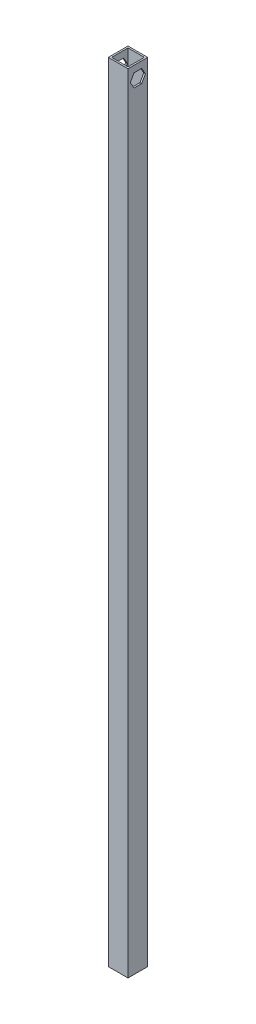
ISO-10303-21;
HEADER;
FILE_DESCRIPTION(('STEP AP214'),'2;1');
FILE_NAME('part.step','',(''),(''),'','','');
FILE_SCHEMA(('AUTOMOTIVE_DESIGN { 1 0 10303 214 1 1 1 1 }'));
ENDSEC;
DATA;
#1=APPLICATION_CONTEXT('core data for automotive mechanical design processes');
#2=APPLICATION_PROTOCOL_DEFINITION('international standard','automotive_design',2000,#1);
#3=PRODUCT_CONTEXT('',#1,'mechanical');
#4=PRODUCT('Part','Part','',(#3));
#5=PRODUCT_RELATED_PRODUCT_CATEGORY('part','',(#4));
#6=PRODUCT_DEFINITION_FORMATION('','',#4);
#7=PRODUCT_DEFINITION_CONTEXT('part definition',#1,'design');
#8=PRODUCT_DEFINITION('design','',#6,#7);
#9=PRODUCT_DEFINITION_SHAPE('','',#8);
#10=(LENGTH_UNIT() NAMED_UNIT(*) SI_UNIT(.MILLI.,.METRE.));
#11=(NAMED_UNIT(*) PLANE_ANGLE_UNIT() SI_UNIT($,.RADIAN.));
#12=(NAMED_UNIT(*) SI_UNIT($,.STERADIAN.) SOLID_ANGLE_UNIT());
#13=UNCERTAINTY_MEASURE_WITH_UNIT(LENGTH_MEASURE(1.E-05),#10,'distance_accuracy_value','');
#14=(GEOMETRIC_REPRESENTATION_CONTEXT(3) GLOBAL_UNCERTAINTY_ASSIGNED_CONTEXT((#13)) GLOBAL_UNIT_ASSIGNED_CONTEXT((#10,
#11,#12)) REPRESENTATION_CONTEXT('',''));
#15=CARTESIAN_POINT('',(0.,0.,0.));
#16=DIRECTION('',(0.,0.,1.));
#17=DIRECTION('',(1.,0.,0.));
#18=AXIS2_PLACEMENT_3D('',#15,#16,#17);
#19=CARTESIAN_POINT('',(0.,1524.,0.));
#20=DIRECTION('',(0.,-1.,0.));
#21=DIRECTION('',(0.,0.,-1.));
#22=AXIS2_PLACEMENT_3D('',#19,#20,#21);
#23=PLANE('',#22);
#24=DIRECTION('',(0.,0.,1.));
#25=VECTOR('',#24,1.);
#26=CARTESIAN_POINT('',(0.,1524.,0.));
#27=LINE('',#26,#25);
#28=CARTESIAN_POINT('',(0.,1524.,-38.1));
#29=VERTEX_POINT('',#28);
#30=CARTESIAN_POINT('',(0.,1524.,0.));
#31=VERTEX_POINT('',#30);
#32=EDGE_CURVE('E279',#29,#31,#27,.T.);
#33=ORIENTED_EDGE('',*,*,#32,.T.);
#34=DIRECTION('',(1.,0.,0.));
#35=VECTOR('',#34,1.);
#36=CARTESIAN_POINT('',(0.,1524.,0.));
#37=LINE('',#36,#35);
#38=CARTESIAN_POINT('',(38.1,1524.,0.));
#39=VERTEX_POINT('',#38);
#40=EDGE_CURVE('E282',#31,#39,#37,.T.);
#41=ORIENTED_EDGE('',*,*,#40,.T.);
#42=DIRECTION('',(0.,0.,-1.));
#43=VECTOR('',#42,1.);
#44=CARTESIAN_POINT('',(38.1,1524.,0.));
#45=LINE('',#44,#43);
#46=CARTESIAN_POINT('',(38.1,1524.,-38.1));
#47=VERTEX_POINT('',#46);
#48=EDGE_CURVE('E285',#39,#47,#45,.T.);
#49=ORIENTED_EDGE('',*,*,#48,.T.);
#50=DIRECTION('',(-1.,0.,0.));
#51=VECTOR('',#50,1.);
#52=CARTESIAN_POINT('',(0.,1524.,-38.1));
#53=LINE('',#52,#51);
#54=EDGE_CURVE('E287',#47,#29,#53,.T.);
#55=ORIENTED_EDGE('',*,*,#54,.T.);
#56=EDGE_LOOP('',(#33,#41,#49,#55));
#57=FACE_BOUND('',#56,.T.);
#58=DIRECTION('',(0.,0.,1.));
#59=VECTOR('',#58,1.);
#60=CARTESIAN_POINT('',(3.175,1524.,-3.175));
#61=LINE('',#60,#59);
#62=CARTESIAN_POINT('',(3.175,1524.,-34.925));
#63=VERTEX_POINT('',#62);
#64=CARTESIAN_POINT('',(3.175,1524.,-3.175));
#65=VERTEX_POINT('',#64);
#66=EDGE_CURVE('E248',#63,#65,#61,.T.);
#67=ORIENTED_EDGE('',*,*,#66,.F.);
#68=DIRECTION('',(-1.,0.,0.));
#69=VECTOR('',#68,1.);
#70=CARTESIAN_POINT('',(3.175,1524.,-34.925));
#71=LINE('',#70,#69);
#72=CARTESIAN_POINT('',(34.925,1524.,-34.925));
#73=VERTEX_POINT('',#72);
#74=EDGE_CURVE('E256',#73,#63,#71,.T.);
#75=ORIENTED_EDGE('',*,*,#74,.F.);
#76=DIRECTION('',(0.,0.,-1.));
#77=VECTOR('',#76,1.);
#78=CARTESIAN_POINT('',(34.925,1524.,-3.175));
#79=LINE('',#78,#77);
#80=CARTESIAN_POINT('',(34.925,1524.,-3.175));
#81=VERTEX_POINT('',#80);
#82=EDGE_CURVE('E253',#81,#73,#79,.T.);
#83=ORIENTED_EDGE('',*,*,#82,.F.);
#84=DIRECTION('',(1.,0.,0.));
#85=VECTOR('',#84,1.);
#86=CARTESIAN_POINT('',(3.175,1524.,-3.175));
#87=LINE('',#86,#85);
#88=EDGE_CURVE('E250',#65,#81,#87,.T.);
#89=ORIENTED_EDGE('',*,*,#88,.F.);
#90=EDGE_LOOP('',(#67,#75,#83,#89));
#91=FACE_BOUND('',#90,.T.);
#92=ADVANCED_FACE('F33',(#57,#91),#23,.F.);
#93=CARTESIAN_POINT('',(0.,0.,0.));
#94=DIRECTION('',(0.,-1.,0.));
#95=DIRECTION('',(0.,0.,-1.));
#96=AXIS2_PLACEMENT_3D('',#93,#94,#95);
#97=PLANE('',#96);
#98=DIRECTION('',(0.,0.,1.));
#99=VECTOR('',#98,1.);
#100=CARTESIAN_POINT('',(0.,0.,0.));
#101=LINE('',#100,#99);
#102=CARTESIAN_POINT('',(0.,0.,-38.1));
#103=VERTEX_POINT('',#102);
#104=CARTESIAN_POINT('',(0.,0.,0.));
#105=VERTEX_POINT('',#104);
#106=EDGE_CURVE('E278',#103,#105,#101,.T.);
#107=ORIENTED_EDGE('',*,*,#106,.F.);
#108=DIRECTION('',(-1.,0.,0.));
#109=VECTOR('',#108,1.);
#110=CARTESIAN_POINT('',(0.,0.,-38.1));
#111=LINE('',#110,#109);
#112=CARTESIAN_POINT('',(38.1,0.,-38.1));
#113=VERTEX_POINT('',#112);
#114=EDGE_CURVE('E283',#113,#103,#111,.T.);
#115=ORIENTED_EDGE('',*,*,#114,.F.);
#116=DIRECTION('',(0.,0.,-1.));
#117=VECTOR('',#116,1.);
#118=CARTESIAN_POINT('',(38.1,0.,0.));
#119=LINE('',#118,#117);
#120=CARTESIAN_POINT('',(38.1,0.,0.));
#121=VERTEX_POINT('',#120);
#122=EDGE_CURVE('E294',#121,#113,#119,.T.);
#123=ORIENTED_EDGE('',*,*,#122,.F.);
#124=DIRECTION('',(1.,0.,0.));
#125=VECTOR('',#124,1.);
#126=CARTESIAN_POINT('',(0.,0.,0.));
#127=LINE('',#126,#125);
#128=EDGE_CURVE('E292',#105,#121,#127,.T.);
#129=ORIENTED_EDGE('',*,*,#128,.F.);
#130=EDGE_LOOP('',(#107,#115,#123,#129));
#131=FACE_BOUND('',#130,.T.);
#132=DIRECTION('',(-1.,0.,0.));
#133=VECTOR('',#132,1.);
#134=CARTESIAN_POINT('',(3.175,0.,-34.925));
#135=LINE('',#134,#133);
#136=CARTESIAN_POINT('',(34.925,0.,-34.925));
#137=VERTEX_POINT('',#136);
#138=CARTESIAN_POINT('',(3.175,0.,-34.925));
#139=VERTEX_POINT('',#138);
#140=EDGE_CURVE('E251',#137,#139,#135,.T.);
#141=ORIENTED_EDGE('',*,*,#140,.T.);
#142=DIRECTION('',(0.,0.,1.));
#143=VECTOR('',#142,1.);
#144=CARTESIAN_POINT('',(3.175,0.,-3.175));
#145=LINE('',#144,#143);
#146=CARTESIAN_POINT('',(3.175,0.,-3.175));
#147=VERTEX_POINT('',#146);
#148=EDGE_CURVE('E247',#139,#147,#145,.T.);
#149=ORIENTED_EDGE('',*,*,#148,.T.);
#150=DIRECTION('',(1.,0.,0.));
#151=VECTOR('',#150,1.);
#152=CARTESIAN_POINT('',(3.175,0.,-3.175));
#153=LINE('',#152,#151);
#154=CARTESIAN_POINT('',(34.925,0.,-3.175));
#155=VERTEX_POINT('',#154);
#156=EDGE_CURVE('E261',#147,#155,#153,.T.);
#157=ORIENTED_EDGE('',*,*,#156,.T.);
#158=DIRECTION('',(0.,0.,-1.));
#159=VECTOR('',#158,1.);
#160=CARTESIAN_POINT('',(34.925,0.,-3.175));
#161=LINE('',#160,#159);
#162=EDGE_CURVE('E264',#155,#137,#161,.T.);
#163=ORIENTED_EDGE('',*,*,#162,.T.);
#164=EDGE_LOOP('',(#141,#149,#157,#163));
#165=FACE_BOUND('',#164,.T.);
#166=ADVANCED_FACE('F359',(#131,#165),#97,.T.);
#167=CARTESIAN_POINT('',(0.,1524.,0.));
#168=DIRECTION('',(1.,0.,0.));
#169=DIRECTION('',(0.,0.,-1.));
#170=AXIS2_PLACEMENT_3D('',#167,#168,#169);
#171=PLANE('',#170);
#172=DIRECTION('',(0.,0.,-1.));
#173=VECTOR('',#172,1.);
#174=CARTESIAN_POINT('',(0.,1485.9,-11.7176515812917));
#175=LINE('',#174,#173);
#176=CARTESIAN_POINT('',(0.,1485.9,-11.7176515812917));
#177=VERTEX_POINT('',#176);
#178=CARTESIAN_POINT('',(0.,1485.9,-26.3823484187083));
#179=VERTEX_POINT('',#178);
#180=EDGE_CURVE('E194',#177,#179,#175,.T.);
#181=ORIENTED_EDGE('',*,*,#180,.T.);
#182=DIRECTION('',(0.,0.866025403784437,-0.500000000000003));
#183=VECTOR('',#182,1.);
#184=CARTESIAN_POINT('',(0.,1485.9,-26.3823484187083));
#185=LINE('',#184,#183);
#186=CARTESIAN_POINT('',(0.,1498.6,-33.7146968374168));
#187=VERTEX_POINT('',#186);
#188=EDGE_CURVE('E176',#179,#187,#185,.T.);
#189=ORIENTED_EDGE('',*,*,#188,.T.);
#190=DIRECTION('',(0.,0.86602540378444,0.499999999999997));
#191=VECTOR('',#190,1.);
#192=CARTESIAN_POINT('',(0.,1498.6,-33.7146968374168));
#193=LINE('',#192,#191);
#194=CARTESIAN_POINT('',(0.,1511.3,-26.3823484187084));
#195=VERTEX_POINT('',#194);
#196=EDGE_CURVE('E186',#187,#195,#193,.T.);
#197=ORIENTED_EDGE('',*,*,#196,.T.);
#198=DIRECTION('',(0.,0.,1.));
#199=VECTOR('',#198,1.);
#200=CARTESIAN_POINT('',(0.,1511.3,-26.3823484187084));
#201=LINE('',#200,#199);
#202=CARTESIAN_POINT('',(0.,1511.3,-11.7176515812918));
#203=VERTEX_POINT('',#202);
#204=EDGE_CURVE('E48',#195,#203,#201,.T.);
#205=ORIENTED_EDGE('',*,*,#204,.T.);
#206=DIRECTION('',(0.,-0.86602540378444,0.499999999999997));
#207=VECTOR('',#206,1.);
#208=CARTESIAN_POINT('',(0.,1511.3,-11.7176515812918));
#209=LINE('',#208,#207);
#210=CARTESIAN_POINT('',(0.,1498.6,-4.38530316258331));
#211=VERTEX_POINT('',#210);
#212=EDGE_CURVE('E202',#203,#211,#209,.T.);
#213=ORIENTED_EDGE('',*,*,#212,.T.);
#214=DIRECTION('',(0.,-0.866025403784437,-0.500000000000003));
#215=VECTOR('',#214,1.);
#216=CARTESIAN_POINT('',(0.,1498.6,-4.38530316258331));
#217=LINE('',#216,#215);
#218=EDGE_CURVE('E205',#211,#177,#217,.T.);
#219=ORIENTED_EDGE('',*,*,#218,.T.);
#220=EDGE_LOOP('',(#181,#189,#197,#205,#213,#219));
#221=FACE_BOUND('',#220,.T.);
#222=ORIENTED_EDGE('',*,*,#106,.T.);
#223=DIRECTION('',(0.,-1.,0.));
#224=VECTOR('',#223,1.);
#225=CARTESIAN_POINT('',(0.,1524.,0.));
#226=LINE('',#225,#224);
#227=EDGE_CURVE('E305',#31,#105,#226,.T.);
#228=ORIENTED_EDGE('',*,*,#227,.F.);
#229=ORIENTED_EDGE('',*,*,#32,.F.);
#230=DIRECTION('',(0.,-1.,0.));
#231=VECTOR('',#230,1.);
#232=CARTESIAN_POINT('',(0.,1524.,-38.1));
#233=LINE('',#232,#231);
#234=EDGE_CURVE('E289',#29,#103,#233,.T.);
#235=ORIENTED_EDGE('',*,*,#234,.T.);
#236=EDGE_LOOP('',(#222,#228,#229,#235));
#237=FACE_BOUND('',#236,.T.);
#238=ADVANCED_FACE('F35',(#221,#237),#171,.F.);
#239=CARTESIAN_POINT('',(0.,1524.,0.));
#240=DIRECTION('',(0.,0.,-1.));
#241=DIRECTION('',(-1.,0.,0.));
#242=AXIS2_PLACEMENT_3D('',#239,#240,#241);
#243=PLANE('',#242);
#244=ORIENTED_EDGE('',*,*,#128,.T.);
#245=DIRECTION('',(0.,-1.,0.));
#246=VECTOR('',#245,1.);
#247=CARTESIAN_POINT('',(38.1,1524.,0.));
#248=LINE('',#247,#246);
#249=EDGE_CURVE('E302',#39,#121,#248,.T.);
#250=ORIENTED_EDGE('',*,*,#249,.F.);
#251=ORIENTED_EDGE('',*,*,#40,.F.);
#252=ORIENTED_EDGE('',*,*,#227,.T.);
#253=EDGE_LOOP('',(#244,#250,#251,#252));
#254=FACE_BOUND('',#253,.T.);
#255=ADVANCED_FACE('F377',(#254),#243,.F.);
#256=CARTESIAN_POINT('',(38.1,1524.,0.));
#257=DIRECTION('',(-1.,0.,0.));
#258=DIRECTION('',(0.,0.,1.));
#259=AXIS2_PLACEMENT_3D('',#256,#257,#258);
#260=PLANE('',#259);
#261=DIRECTION('',(0.,0.86602540378444,0.499999999999997));
#262=VECTOR('',#261,1.);
#263=CARTESIAN_POINT('',(38.1,1498.6,-33.7146968374168));
#264=LINE('',#263,#262);
#265=CARTESIAN_POINT('',(38.1,1498.6,-33.7146968374167));
#266=VERTEX_POINT('',#265);
#267=CARTESIAN_POINT('',(38.1,1511.3,-26.3823484187084));
#268=VERTEX_POINT('',#267);
#269=EDGE_CURVE('E209',#266,#268,#264,.T.);
#270=ORIENTED_EDGE('',*,*,#269,.F.);
#271=DIRECTION('',(0.,0.866025403784437,-0.500000000000003));
#272=VECTOR('',#271,1.);
#273=CARTESIAN_POINT('',(38.1,1485.9,-26.3823484187083));
#274=LINE('',#273,#272);
#275=CARTESIAN_POINT('',(38.1,1485.9,-26.3823484187083));
#276=VERTEX_POINT('',#275);
#277=EDGE_CURVE('E56',#276,#266,#274,.T.);
#278=ORIENTED_EDGE('',*,*,#277,.F.);
#279=DIRECTION('',(0.,0.,-1.));
#280=VECTOR('',#279,1.);
#281=CARTESIAN_POINT('',(38.1,1485.9,-11.7176515812917));
#282=LINE('',#281,#280);
#283=CARTESIAN_POINT('',(38.1,1485.9,-11.7176515812917));
#284=VERTEX_POINT('',#283);
#285=EDGE_CURVE('E195',#284,#276,#282,.T.);
#286=ORIENTED_EDGE('',*,*,#285,.F.);
#287=DIRECTION('',(0.,-0.866025403784437,-0.500000000000003));
#288=VECTOR('',#287,1.);
#289=CARTESIAN_POINT('',(38.1,1498.6,-4.38530316258332));
#290=LINE('',#289,#288);
#291=CARTESIAN_POINT('',(38.1,1498.6,-4.38530316258332));
#292=VERTEX_POINT('',#291);
#293=EDGE_CURVE('E198',#292,#284,#290,.T.);
#294=ORIENTED_EDGE('',*,*,#293,.F.);
#295=DIRECTION('',(0.,-0.86602540378444,0.499999999999997));
#296=VECTOR('',#295,1.);
#297=CARTESIAN_POINT('',(38.1,1511.3,-11.7176515812919));
#298=LINE('',#297,#296);
#299=CARTESIAN_POINT('',(38.1,1511.3,-11.7176515812919));
#300=VERTEX_POINT('',#299);
#301=EDGE_CURVE('E215',#300,#292,#298,.T.);
#302=ORIENTED_EDGE('',*,*,#301,.F.);
#303=DIRECTION('',(0.,0.,1.));
#304=VECTOR('',#303,1.);
#305=CARTESIAN_POINT('',(38.1,1511.3,-26.3823484187084));
#306=LINE('',#305,#304);
#307=EDGE_CURVE('E212',#268,#300,#306,.T.);
#308=ORIENTED_EDGE('',*,*,#307,.F.);
#309=EDGE_LOOP('',(#270,#278,#286,#294,#302,#308));
#310=FACE_BOUND('',#309,.T.);
#311=ORIENTED_EDGE('',*,*,#122,.T.);
#312=DIRECTION('',(0.,-1.,0.));
#313=VECTOR('',#312,1.);
#314=CARTESIAN_POINT('',(38.1,1524.,-38.1));
#315=LINE('',#314,#313);
#316=EDGE_CURVE('E299',#47,#113,#315,.T.);
#317=ORIENTED_EDGE('',*,*,#316,.F.);
#318=ORIENTED_EDGE('',*,*,#48,.F.);
#319=ORIENTED_EDGE('',*,*,#249,.T.);
#320=EDGE_LOOP('',(#311,#317,#318,#319));
#321=FACE_BOUND('',#320,.T.);
#322=ADVANCED_FACE('F343',(#310,#321),#260,.F.);
#323=CARTESIAN_POINT('',(0.,1524.,-38.1));
#324=DIRECTION('',(0.,0.,1.));
#325=DIRECTION('',(1.,0.,0.));
#326=AXIS2_PLACEMENT_3D('',#323,#324,#325);
#327=PLANE('',#326);
#328=ORIENTED_EDGE('',*,*,#114,.T.);
#329=ORIENTED_EDGE('',*,*,#234,.F.);
#330=ORIENTED_EDGE('',*,*,#54,.F.);
#331=ORIENTED_EDGE('',*,*,#316,.T.);
#332=EDGE_LOOP('',(#328,#329,#330,#331));
#333=FACE_BOUND('',#332,.T.);
#334=ADVANCED_FACE('F372',(#333),#327,.F.);
#335=CARTESIAN_POINT('',(3.175,1524.,-3.175));
#336=DIRECTION('',(1.,0.,0.));
#337=DIRECTION('',(0.,0.,-1.));
#338=AXIS2_PLACEMENT_3D('',#335,#336,#337);
#339=PLANE('',#338);
#340=DIRECTION('',(0.,0.866025403784437,-0.500000000000003));
#341=VECTOR('',#340,1.);
#342=CARTESIAN_POINT('',(3.175,1504.42592335746,-37.078295256125));
#343=LINE('',#342,#341);
#344=CARTESIAN_POINT('',(3.175,1485.9,-26.3823484187083));
#345=VERTEX_POINT('',#344);
#346=CARTESIAN_POINT('',(3.175,1498.6,-33.7146968374167));
#347=VERTEX_POINT('',#346);
#348=EDGE_CURVE('E179',#345,#347,#343,.T.);
#349=ORIENTED_EDGE('',*,*,#348,.F.);
#350=DIRECTION('',(0.,0.,-1.));
#351=VECTOR('',#350,1.);
#352=CARTESIAN_POINT('',(3.175,1485.9,-3.175));
#353=LINE('',#352,#351);
#354=CARTESIAN_POINT('',(3.175,1485.9,-11.7176515812917));
#355=VERTEX_POINT('',#354);
#356=EDGE_CURVE('E244',#355,#345,#353,.T.);
#357=ORIENTED_EDGE('',*,*,#356,.F.);
#358=DIRECTION('',(0.,-0.866025403784437,-0.500000000000003));
#359=VECTOR('',#358,1.);
#360=CARTESIAN_POINT('',(3.175,1518.17407664254,6.91579525612507));
#361=LINE('',#360,#359);
#362=CARTESIAN_POINT('',(3.175,1498.6,-4.38530316258331));
#363=VERTEX_POINT('',#362);
#364=EDGE_CURVE('E242',#363,#355,#361,.T.);
#365=ORIENTED_EDGE('',*,*,#364,.F.);
#366=DIRECTION('',(0.,-0.86602540378444,0.499999999999997));
#367=VECTOR('',#366,1.);
#368=CARTESIAN_POINT('',(3.175,1517.12592335746,-15.0812499999999));
#369=LINE('',#368,#367);
#370=CARTESIAN_POINT('',(3.175,1511.3,-11.7176515812918));
#371=VERTEX_POINT('',#370);
#372=EDGE_CURVE('E240',#371,#363,#369,.T.);
#373=ORIENTED_EDGE('',*,*,#372,.F.);
#374=DIRECTION('',(0.,0.,1.));
#375=VECTOR('',#374,1.);
#376=CARTESIAN_POINT('',(3.175,1511.3,-3.175));
#377=LINE('',#376,#375);
#378=CARTESIAN_POINT('',(3.175,1511.3,-26.3823484187084));
#379=VERTEX_POINT('',#378);
#380=EDGE_CURVE('E238',#379,#371,#377,.T.);
#381=ORIENTED_EDGE('',*,*,#380,.F.);
#382=DIRECTION('',(0.,0.86602540378444,0.499999999999997));
#383=VECTOR('',#382,1.);
#384=CARTESIAN_POINT('',(3.175,1530.87407664254,-15.0812500000003));
#385=LINE('',#384,#383);
#386=EDGE_CURVE('E222',#347,#379,#385,.T.);
#387=ORIENTED_EDGE('',*,*,#386,.F.);
#388=EDGE_LOOP('',(#349,#357,#365,#373,#381,#387));
#389=FACE_BOUND('',#388,.T.);
#390=ORIENTED_EDGE('',*,*,#148,.F.);
#391=DIRECTION('',(0.,-1.,0.));
#392=VECTOR('',#391,1.);
#393=CARTESIAN_POINT('',(3.175,1524.,-34.925));
#394=LINE('',#393,#392);
#395=EDGE_CURVE('E258',#63,#139,#394,.T.);
#396=ORIENTED_EDGE('',*,*,#395,.F.);
#397=ORIENTED_EDGE('',*,*,#66,.T.);
#398=DIRECTION('',(0.,-1.,0.));
#399=VECTOR('',#398,1.);
#400=CARTESIAN_POINT('',(3.175,1524.,-3.175));
#401=LINE('',#400,#399);
#402=EDGE_CURVE('E275',#65,#147,#401,.T.);
#403=ORIENTED_EDGE('',*,*,#402,.T.);
#404=EDGE_LOOP('',(#390,#396,#397,#403));
#405=FACE_BOUND('',#404,.T.);
#406=ADVANCED_FACE('F369',(#389,#405),#339,.T.);
#407=CARTESIAN_POINT('',(3.175,1524.,-3.175));
#408=DIRECTION('',(0.,0.,-1.));
#409=DIRECTION('',(-1.,0.,0.));
#410=AXIS2_PLACEMENT_3D('',#407,#408,#409);
#411=PLANE('',#410);
#412=ORIENTED_EDGE('',*,*,#156,.F.);
#413=ORIENTED_EDGE('',*,*,#402,.F.);
#414=ORIENTED_EDGE('',*,*,#88,.T.);
#415=DIRECTION('',(0.,-1.,0.));
#416=VECTOR('',#415,1.);
#417=CARTESIAN_POINT('',(34.925,1524.,-3.175));
#418=LINE('',#417,#416);
#419=EDGE_CURVE('E273',#81,#155,#418,.T.);
#420=ORIENTED_EDGE('',*,*,#419,.T.);
#421=EDGE_LOOP('',(#412,#413,#414,#420));
#422=FACE_BOUND('',#421,.T.);
#423=ADVANCED_FACE('F409',(#422),#411,.T.);
#424=CARTESIAN_POINT('',(34.925,1524.,-3.175));
#425=DIRECTION('',(-1.,0.,0.));
#426=DIRECTION('',(0.,0.,1.));
#427=AXIS2_PLACEMENT_3D('',#424,#425,#426);
#428=PLANE('',#427);
#429=DIRECTION('',(0.,-0.866025403784437,0.500000000000003));
#430=VECTOR('',#429,1.);
#431=CARTESIAN_POINT('',(34.925,1504.42592335746,-37.078295256125));
#432=LINE('',#431,#430);
#433=CARTESIAN_POINT('',(34.925,1498.6,-33.7146968374168));
#434=VERTEX_POINT('',#433);
#435=CARTESIAN_POINT('',(34.925,1485.9,-26.3823484187083));
#436=VERTEX_POINT('',#435);
#437=EDGE_CURVE('E11',#434,#436,#432,.T.);
#438=ORIENTED_EDGE('',*,*,#437,.F.);
#439=DIRECTION('',(0.,-0.86602540378444,-0.499999999999997));
#440=VECTOR('',#439,1.);
#441=CARTESIAN_POINT('',(34.925,1530.87407664254,-15.0812500000003));
#442=LINE('',#441,#440);
#443=CARTESIAN_POINT('',(34.925,1511.3,-26.3823484187084));
#444=VERTEX_POINT('',#443);
#445=EDGE_CURVE('E308',#444,#434,#442,.T.);
#446=ORIENTED_EDGE('',*,*,#445,.F.);
#447=DIRECTION('',(0.,0.,-1.));
#448=VECTOR('',#447,1.);
#449=CARTESIAN_POINT('',(34.925,1511.3,-3.175));
#450=LINE('',#449,#448);
#451=CARTESIAN_POINT('',(34.925,1511.3,-11.7176515812919));
#452=VERTEX_POINT('',#451);
#453=EDGE_CURVE('E310',#452,#444,#450,.T.);
#454=ORIENTED_EDGE('',*,*,#453,.F.);
#455=DIRECTION('',(0.,0.86602540378444,-0.499999999999997));
#456=VECTOR('',#455,1.);
#457=CARTESIAN_POINT('',(34.925,1517.12592335746,-15.08125));
#458=LINE('',#457,#456);
#459=CARTESIAN_POINT('',(34.925,1498.6,-4.38530316258331));
#460=VERTEX_POINT('',#459);
#461=EDGE_CURVE('E313',#460,#452,#458,.T.);
#462=ORIENTED_EDGE('',*,*,#461,.F.);
#463=DIRECTION('',(0.,0.866025403784437,0.500000000000003));
#464=VECTOR('',#463,1.);
#465=CARTESIAN_POINT('',(34.925,1518.17407664254,6.91579525612507));
#466=LINE('',#465,#464);
#467=CARTESIAN_POINT('',(34.925,1485.9,-11.7176515812917));
#468=VERTEX_POINT('',#467);
#469=EDGE_CURVE('E315',#468,#460,#466,.T.);
#470=ORIENTED_EDGE('',*,*,#469,.F.);
#471=DIRECTION('',(0.,0.,1.));
#472=VECTOR('',#471,1.);
#473=CARTESIAN_POINT('',(34.925,1485.9,-3.175));
#474=LINE('',#473,#472);
#475=EDGE_CURVE('E41',#436,#468,#474,.T.);
#476=ORIENTED_EDGE('',*,*,#475,.F.);
#477=EDGE_LOOP('',(#438,#446,#454,#462,#470,#476));
#478=FACE_BOUND('',#477,.T.);
#479=ORIENTED_EDGE('',*,*,#162,.F.);
#480=ORIENTED_EDGE('',*,*,#419,.F.);
#481=ORIENTED_EDGE('',*,*,#82,.T.);
#482=DIRECTION('',(0.,-1.,0.));
#483=VECTOR('',#482,1.);
#484=CARTESIAN_POINT('',(34.925,1524.,-34.925));
#485=LINE('',#484,#483);
#486=EDGE_CURVE('E271',#73,#137,#485,.T.);
#487=ORIENTED_EDGE('',*,*,#486,.T.);
#488=EDGE_LOOP('',(#479,#480,#481,#487));
#489=FACE_BOUND('',#488,.T.);
#490=ADVANCED_FACE('F330',(#478,#489),#428,.T.);
#491=CARTESIAN_POINT('',(3.175,1524.,-34.925));
#492=DIRECTION('',(0.,0.,1.));
#493=DIRECTION('',(1.,0.,0.));
#494=AXIS2_PLACEMENT_3D('',#491,#492,#493);
#495=PLANE('',#494);
#496=ORIENTED_EDGE('',*,*,#140,.F.);
#497=ORIENTED_EDGE('',*,*,#486,.F.);
#498=ORIENTED_EDGE('',*,*,#74,.T.);
#499=ORIENTED_EDGE('',*,*,#395,.T.);
#500=EDGE_LOOP('',(#496,#497,#498,#499));
#501=FACE_BOUND('',#500,.T.);
#502=ADVANCED_FACE('F399',(#501),#495,.T.);
#503=CARTESIAN_POINT('',(0.,1498.6,-33.7146968374168));
#504=DIRECTION('',(0.,0.499999999999997,-0.86602540378444));
#505=DIRECTION('',(0.,0.86602540378444,0.499999999999997));
#506=AXIS2_PLACEMENT_3D('',#503,#504,#505);
#507=PLANE('',#506);
#508=ORIENTED_EDGE('',*,*,#445,.T.);
#509=DIRECTION('',(1.,0.,0.));
#510=VECTOR('',#509,1.);
#511=CARTESIAN_POINT('',(0.,1498.6,-33.7146968374168));
#512=LINE('',#511,#510);
#513=EDGE_CURVE('E183',#434,#266,#512,.T.);
#514=ORIENTED_EDGE('',*,*,#513,.T.);
#515=ORIENTED_EDGE('',*,*,#269,.T.);
#516=DIRECTION('',(1.,0.,0.));
#517=VECTOR('',#516,1.);
#518=CARTESIAN_POINT('',(0.,1511.3,-26.3823484187084));
#519=LINE('',#518,#517);
#520=EDGE_CURVE('E182',#444,#268,#519,.T.);
#521=ORIENTED_EDGE('',*,*,#520,.F.);
#522=EDGE_LOOP('',(#508,#514,#515,#521));
#523=FACE_BOUND('',#522,.T.);
#524=ADVANCED_FACE('F346',(#523),#507,.F.);
#525=CARTESIAN_POINT('',(0.,1511.3,-26.3823484187084));
#526=DIRECTION('',(0.,1.,0.));
#527=DIRECTION('',(0.,0.,1.));
#528=AXIS2_PLACEMENT_3D('',#525,#526,#527);
#529=PLANE('',#528);
#530=ORIENTED_EDGE('',*,*,#453,.T.);
#531=ORIENTED_EDGE('',*,*,#520,.T.);
#532=ORIENTED_EDGE('',*,*,#307,.T.);
#533=DIRECTION('',(1.,0.,0.));
#534=VECTOR('',#533,1.);
#535=CARTESIAN_POINT('',(0.,1511.3,-11.7176515812918));
#536=LINE('',#535,#534);
#537=EDGE_CURVE('E235',#452,#300,#536,.T.);
#538=ORIENTED_EDGE('',*,*,#537,.F.);
#539=EDGE_LOOP('',(#530,#531,#532,#538));
#540=FACE_BOUND('',#539,.T.);
#541=ADVANCED_FACE('F338',(#540),#529,.F.);
#542=CARTESIAN_POINT('',(0.,1511.3,-11.7176515812918));
#543=DIRECTION('',(0.,0.499999999999997,0.86602540378444));
#544=DIRECTION('',(0.,-0.86602540378444,0.499999999999997));
#545=AXIS2_PLACEMENT_3D('',#542,#543,#544);
#546=PLANE('',#545);
#547=ORIENTED_EDGE('',*,*,#461,.T.);
#548=ORIENTED_EDGE('',*,*,#537,.T.);
#549=ORIENTED_EDGE('',*,*,#301,.T.);
#550=DIRECTION('',(1.,0.,0.));
#551=VECTOR('',#550,1.);
#552=CARTESIAN_POINT('',(0.,1498.6,-4.38530316258331));
#553=LINE('',#552,#551);
#554=EDGE_CURVE('E231',#460,#292,#553,.T.);
#555=ORIENTED_EDGE('',*,*,#554,.F.);
#556=EDGE_LOOP('',(#547,#548,#549,#555));
#557=FACE_BOUND('',#556,.T.);
#558=ADVANCED_FACE('F336',(#557),#546,.F.);
#559=CARTESIAN_POINT('',(0.,1498.6,-4.38530316258331));
#560=DIRECTION('',(0.,-0.500000000000003,0.866025403784437));
#561=DIRECTION('',(0.,-0.866025403784437,-0.500000000000003));
#562=AXIS2_PLACEMENT_3D('',#559,#560,#561);
#563=PLANE('',#562);
#564=ORIENTED_EDGE('',*,*,#469,.T.);
#565=ORIENTED_EDGE('',*,*,#554,.T.);
#566=ORIENTED_EDGE('',*,*,#293,.T.);
#567=DIRECTION('',(1.,0.,0.));
#568=VECTOR('',#567,1.);
#569=CARTESIAN_POINT('',(0.,1485.9,-11.7176515812917));
#570=LINE('',#569,#568);
#571=EDGE_CURVE('E227',#468,#284,#570,.T.);
#572=ORIENTED_EDGE('',*,*,#571,.F.);
#573=EDGE_LOOP('',(#564,#565,#566,#572));
#574=FACE_BOUND('',#573,.T.);
#575=ADVANCED_FACE('F325',(#574),#563,.F.);
#576=CARTESIAN_POINT('',(0.,1485.9,-11.7176515812917));
#577=DIRECTION('',(0.,-1.,0.));
#578=DIRECTION('',(0.,0.,-1.));
#579=AXIS2_PLACEMENT_3D('',#576,#577,#578);
#580=PLANE('',#579);
#581=ORIENTED_EDGE('',*,*,#475,.T.);
#582=ORIENTED_EDGE('',*,*,#571,.T.);
#583=ORIENTED_EDGE('',*,*,#285,.T.);
#584=DIRECTION('',(1.,0.,0.));
#585=VECTOR('',#584,1.);
#586=CARTESIAN_POINT('',(0.,1485.9,-26.3823484187083));
#587=LINE('',#586,#585);
#588=EDGE_CURVE('E223',#436,#276,#587,.T.);
#589=ORIENTED_EDGE('',*,*,#588,.F.);
#590=EDGE_LOOP('',(#581,#582,#583,#589));
#591=FACE_BOUND('',#590,.T.);
#592=ADVANCED_FACE('F320',(#591),#580,.F.);
#593=CARTESIAN_POINT('',(0.,1485.9,-26.3823484187083));
#594=DIRECTION('',(0.,-0.500000000000003,-0.866025403784437));
#595=DIRECTION('',(0.,0.866025403784437,-0.500000000000003));
#596=AXIS2_PLACEMENT_3D('',#593,#594,#595);
#597=PLANE('',#596);
#598=ORIENTED_EDGE('',*,*,#437,.T.);
#599=ORIENTED_EDGE('',*,*,#588,.T.);
#600=ORIENTED_EDGE('',*,*,#277,.T.);
#601=ORIENTED_EDGE('',*,*,#513,.F.);
#602=EDGE_LOOP('',(#598,#599,#600,#601));
#603=FACE_BOUND('',#602,.T.);
#604=ADVANCED_FACE('F347',(#603),#597,.F.);
#605=ORIENTED_EDGE('',*,*,#348,.T.);
#606=EDGE_CURVE('E171',#187,#347,#512,.T.);
#607=ORIENTED_EDGE('',*,*,#606,.F.);
#608=ORIENTED_EDGE('',*,*,#188,.F.);
#609=EDGE_CURVE('E220',#179,#345,#587,.T.);
#610=ORIENTED_EDGE('',*,*,#609,.T.);
#611=EDGE_LOOP('',(#605,#607,#608,#610));
#612=FACE_BOUND('',#611,.T.);
#613=ADVANCED_FACE('F173',(#612),#597,.F.);
#614=ORIENTED_EDGE('',*,*,#356,.T.);
#615=ORIENTED_EDGE('',*,*,#609,.F.);
#616=ORIENTED_EDGE('',*,*,#180,.F.);
#617=EDGE_CURVE('E224',#177,#355,#570,.T.);
#618=ORIENTED_EDGE('',*,*,#617,.T.);
#619=EDGE_LOOP('',(#614,#615,#616,#618));
#620=FACE_BOUND('',#619,.T.);
#621=ADVANCED_FACE('F354',(#620),#580,.F.);
#622=ORIENTED_EDGE('',*,*,#364,.T.);
#623=ORIENTED_EDGE('',*,*,#617,.F.);
#624=ORIENTED_EDGE('',*,*,#218,.F.);
#625=EDGE_CURVE('E228',#211,#363,#553,.T.);
#626=ORIENTED_EDGE('',*,*,#625,.T.);
#627=EDGE_LOOP('',(#622,#623,#624,#626));
#628=FACE_BOUND('',#627,.T.);
#629=ADVANCED_FACE('F432',(#628),#563,.F.);
#630=ORIENTED_EDGE('',*,*,#372,.T.);
#631=ORIENTED_EDGE('',*,*,#625,.F.);
#632=ORIENTED_EDGE('',*,*,#212,.F.);
#633=EDGE_CURVE('E232',#203,#371,#536,.T.);
#634=ORIENTED_EDGE('',*,*,#633,.T.);
#635=EDGE_LOOP('',(#630,#631,#632,#634));
#636=FACE_BOUND('',#635,.T.);
#637=ADVANCED_FACE('F430',(#636),#546,.F.);
#638=ORIENTED_EDGE('',*,*,#380,.T.);
#639=ORIENTED_EDGE('',*,*,#633,.F.);
#640=ORIENTED_EDGE('',*,*,#204,.F.);
#641=EDGE_CURVE('E188',#195,#379,#519,.T.);
#642=ORIENTED_EDGE('',*,*,#641,.T.);
#643=EDGE_LOOP('',(#638,#639,#640,#642));
#644=FACE_BOUND('',#643,.T.);
#645=ADVANCED_FACE('F427',(#644),#529,.F.);
#646=ORIENTED_EDGE('',*,*,#386,.T.);
#647=ORIENTED_EDGE('',*,*,#641,.F.);
#648=ORIENTED_EDGE('',*,*,#196,.F.);
#649=ORIENTED_EDGE('',*,*,#606,.T.);
#650=EDGE_LOOP('',(#646,#647,#648,#649));
#651=FACE_BOUND('',#650,.T.);
#652=ADVANCED_FACE('F187',(#651),#507,.F.);
#653=CLOSED_SHELL('',(#92,#166,#238,#255,#322,#334,#406,#423,#490,#502,#524,#541,#558,#575,#592,
#604,#613,#621,#629,#637,#645,#652));
#654=MANIFOLD_SOLID_BREP('B2',#653);
#655=ADVANCED_BREP_SHAPE_REPRESENTATION('',(#18,#654),#14);
#656=SHAPE_DEFINITION_REPRESENTATION(#9,#655);
ENDSEC;
END-ISO-10303-21;
